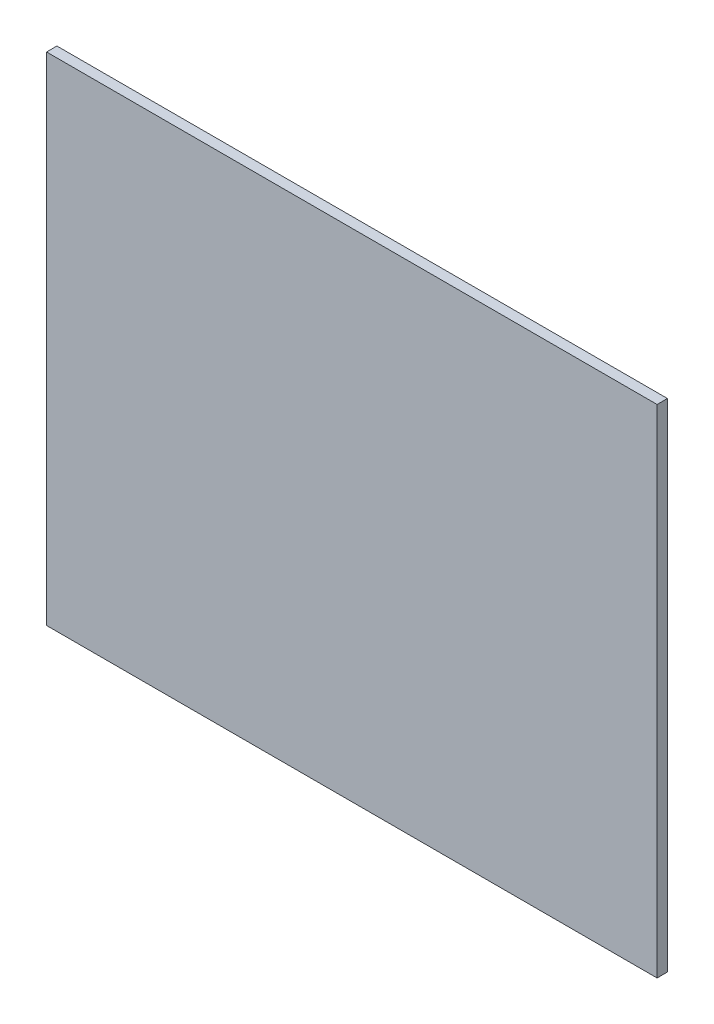
ISO-10303-21;
HEADER;
FILE_DESCRIPTION(('STEP AP214'),'2;1');
FILE_NAME('part.step','',(''),(''),'','','');
FILE_SCHEMA(('AUTOMOTIVE_DESIGN { 1 0 10303 214 1 1 1 1 }'));
ENDSEC;
DATA;
#1=APPLICATION_CONTEXT('core data for automotive mechanical design processes');
#2=APPLICATION_PROTOCOL_DEFINITION('international standard','automotive_design',2000,#1);
#3=PRODUCT_CONTEXT('',#1,'mechanical');
#4=PRODUCT('Part','Part','',(#3));
#5=PRODUCT_RELATED_PRODUCT_CATEGORY('part','',(#4));
#6=PRODUCT_DEFINITION_FORMATION('','',#4);
#7=PRODUCT_DEFINITION_CONTEXT('part definition',#1,'design');
#8=PRODUCT_DEFINITION('design','',#6,#7);
#9=PRODUCT_DEFINITION_SHAPE('','',#8);
#10=(LENGTH_UNIT() NAMED_UNIT(*) SI_UNIT(.MILLI.,.METRE.));
#11=(NAMED_UNIT(*) PLANE_ANGLE_UNIT() SI_UNIT($,.RADIAN.));
#12=(NAMED_UNIT(*) SI_UNIT($,.STERADIAN.) SOLID_ANGLE_UNIT());
#13=UNCERTAINTY_MEASURE_WITH_UNIT(LENGTH_MEASURE(1.E-05),#10,'distance_accuracy_value','');
#14=(GEOMETRIC_REPRESENTATION_CONTEXT(3) GLOBAL_UNCERTAINTY_ASSIGNED_CONTEXT((#13)) GLOBAL_UNIT_ASSIGNED_CONTEXT((#10,
#11,#12)) REPRESENTATION_CONTEXT('',''));
#15=CARTESIAN_POINT('',(0.,0.,0.));
#16=DIRECTION('',(0.,0.,1.));
#17=DIRECTION('',(1.,0.,0.));
#18=AXIS2_PLACEMENT_3D('',#15,#16,#17);
#19=CARTESIAN_POINT('',(147.5,-120.,5.));
#20=DIRECTION('',(-1.,0.,0.));
#21=DIRECTION('',(0.,0.,1.));
#22=AXIS2_PLACEMENT_3D('',#19,#20,#21);
#23=PLANE('',#22);
#24=DIRECTION('',(0.,1.,0.));
#25=VECTOR('',#24,1.);
#26=CARTESIAN_POINT('',(147.5,-120.,0.));
#27=LINE('',#26,#25);
#28=CARTESIAN_POINT('',(147.5,-120.,0.));
#29=VERTEX_POINT('',#28);
#30=CARTESIAN_POINT('',(147.5,120.,0.));
#31=VERTEX_POINT('',#30);
#32=EDGE_CURVE('E107',#29,#31,#27,.T.);
#33=ORIENTED_EDGE('',*,*,#32,.T.);
#34=DIRECTION('',(0.,0.,-1.));
#35=VECTOR('',#34,1.);
#36=CARTESIAN_POINT('',(147.5,120.,5.));
#37=LINE('',#36,#35);
#38=CARTESIAN_POINT('',(147.5,120.,5.));
#39=VERTEX_POINT('',#38);
#40=EDGE_CURVE('E11',#39,#31,#37,.T.);
#41=ORIENTED_EDGE('',*,*,#40,.F.);
#42=DIRECTION('',(0.,1.,0.));
#43=VECTOR('',#42,1.);
#44=CARTESIAN_POINT('',(147.5,-120.,5.));
#45=LINE('',#44,#43);
#46=CARTESIAN_POINT('',(147.5,-120.,5.));
#47=VERTEX_POINT('',#46);
#48=EDGE_CURVE('E91',#47,#39,#45,.T.);
#49=ORIENTED_EDGE('',*,*,#48,.F.);
#50=DIRECTION('',(0.,0.,-1.));
#51=VECTOR('',#50,1.);
#52=CARTESIAN_POINT('',(147.5,-120.,5.));
#53=LINE('',#52,#51);
#54=EDGE_CURVE('E103',#47,#29,#53,.T.);
#55=ORIENTED_EDGE('',*,*,#54,.T.);
#56=EDGE_LOOP('',(#33,#41,#49,#55));
#57=FACE_BOUND('',#56,.T.);
#58=ADVANCED_FACE('F39',(#57),#23,.F.);
#59=CARTESIAN_POINT('',(-147.5,120.,5.));
#60=DIRECTION('',(0.,-1.,0.));
#61=DIRECTION('',(0.,0.,-1.));
#62=AXIS2_PLACEMENT_3D('',#59,#60,#61);
#63=PLANE('',#62);
#64=DIRECTION('',(-1.,0.,0.));
#65=VECTOR('',#64,1.);
#66=CARTESIAN_POINT('',(-147.5,120.,0.));
#67=LINE('',#66,#65);
#68=CARTESIAN_POINT('',(-147.5,120.,0.));
#69=VERTEX_POINT('',#68);
#70=EDGE_CURVE('E96',#31,#69,#67,.T.);
#71=ORIENTED_EDGE('',*,*,#70,.T.);
#72=DIRECTION('',(0.,0.,-1.));
#73=VECTOR('',#72,1.);
#74=CARTESIAN_POINT('',(-147.5,120.,5.));
#75=LINE('',#74,#73);
#76=CARTESIAN_POINT('',(-147.5,120.,5.));
#77=VERTEX_POINT('',#76);
#78=EDGE_CURVE('E48',#77,#69,#75,.T.);
#79=ORIENTED_EDGE('',*,*,#78,.F.);
#80=DIRECTION('',(-1.,0.,0.));
#81=VECTOR('',#80,1.);
#82=CARTESIAN_POINT('',(-147.5,120.,5.));
#83=LINE('',#82,#81);
#84=EDGE_CURVE('E86',#39,#77,#83,.T.);
#85=ORIENTED_EDGE('',*,*,#84,.F.);
#86=ORIENTED_EDGE('',*,*,#40,.T.);
#87=EDGE_LOOP('',(#71,#79,#85,#86));
#88=FACE_BOUND('',#87,.T.);
#89=ADVANCED_FACE('F95',(#88),#63,.F.);
#90=CARTESIAN_POINT('',(-147.5,-120.,5.));
#91=DIRECTION('',(1.,0.,0.));
#92=DIRECTION('',(0.,0.,-1.));
#93=AXIS2_PLACEMENT_3D('',#90,#91,#92);
#94=PLANE('',#93);
#95=DIRECTION('',(0.,-1.,0.));
#96=VECTOR('',#95,1.);
#97=CARTESIAN_POINT('',(-147.5,-120.,0.));
#98=LINE('',#97,#96);
#99=CARTESIAN_POINT('',(-147.5,-120.,0.));
#100=VERTEX_POINT('',#99);
#101=EDGE_CURVE('E73',#69,#100,#98,.T.);
#102=ORIENTED_EDGE('',*,*,#101,.T.);
#103=DIRECTION('',(0.,0.,-1.));
#104=VECTOR('',#103,1.);
#105=CARTESIAN_POINT('',(-147.5,-120.,5.));
#106=LINE('',#105,#104);
#107=CARTESIAN_POINT('',(-147.5,-120.,5.));
#108=VERTEX_POINT('',#107);
#109=EDGE_CURVE('E98',#108,#100,#106,.T.);
#110=ORIENTED_EDGE('',*,*,#109,.F.);
#111=DIRECTION('',(0.,-1.,0.));
#112=VECTOR('',#111,1.);
#113=CARTESIAN_POINT('',(-147.5,-120.,5.));
#114=LINE('',#113,#112);
#115=EDGE_CURVE('E89',#77,#108,#114,.T.);
#116=ORIENTED_EDGE('',*,*,#115,.F.);
#117=ORIENTED_EDGE('',*,*,#78,.T.);
#118=EDGE_LOOP('',(#102,#110,#116,#117));
#119=FACE_BOUND('',#118,.T.);
#120=ADVANCED_FACE('F99',(#119),#94,.F.);
#121=CARTESIAN_POINT('',(-147.5,-120.,5.));
#122=DIRECTION('',(0.,1.,0.));
#123=DIRECTION('',(0.,0.,1.));
#124=AXIS2_PLACEMENT_3D('',#121,#122,#123);
#125=PLANE('',#124);
#126=DIRECTION('',(1.,0.,0.));
#127=VECTOR('',#126,1.);
#128=CARTESIAN_POINT('',(-147.5,-120.,0.));
#129=LINE('',#128,#127);
#130=EDGE_CURVE('E79',#100,#29,#129,.T.);
#131=ORIENTED_EDGE('',*,*,#130,.T.);
#132=ORIENTED_EDGE('',*,*,#54,.F.);
#133=DIRECTION('',(1.,0.,0.));
#134=VECTOR('',#133,1.);
#135=CARTESIAN_POINT('',(-147.5,-120.,5.));
#136=LINE('',#135,#134);
#137=EDGE_CURVE('E56',#108,#47,#136,.T.);
#138=ORIENTED_EDGE('',*,*,#137,.F.);
#139=ORIENTED_EDGE('',*,*,#109,.T.);
#140=EDGE_LOOP('',(#131,#132,#138,#139));
#141=FACE_BOUND('',#140,.T.);
#142=ADVANCED_FACE('F120',(#141),#125,.F.);
#143=CARTESIAN_POINT('',(0.,0.,5.));
#144=DIRECTION('',(0.,0.,-1.));
#145=DIRECTION('',(-1.,0.,0.));
#146=AXIS2_PLACEMENT_3D('',#143,#144,#145);
#147=PLANE('',#146);
#148=ORIENTED_EDGE('',*,*,#48,.T.);
#149=ORIENTED_EDGE('',*,*,#84,.T.);
#150=ORIENTED_EDGE('',*,*,#115,.T.);
#151=ORIENTED_EDGE('',*,*,#137,.T.);
#152=EDGE_LOOP('',(#148,#149,#150,#151));
#153=FACE_BOUND('',#152,.T.);
#154=ADVANCED_FACE('F87',(#153),#147,.F.);
#155=CARTESIAN_POINT('',(0.,0.,0.));
#156=DIRECTION('',(0.,0.,-1.));
#157=DIRECTION('',(-1.,0.,0.));
#158=AXIS2_PLACEMENT_3D('',#155,#156,#157);
#159=PLANE('',#158);
#160=ORIENTED_EDGE('',*,*,#32,.F.);
#161=ORIENTED_EDGE('',*,*,#130,.F.);
#162=ORIENTED_EDGE('',*,*,#101,.F.);
#163=ORIENTED_EDGE('',*,*,#70,.F.);
#164=EDGE_LOOP('',(#160,#161,#162,#163));
#165=FACE_BOUND('',#164,.T.);
#166=ADVANCED_FACE('F123',(#165),#159,.T.);
#167=CLOSED_SHELL('',(#58,#89,#120,#142,#154,#166));
#168=MANIFOLD_SOLID_BREP('B2',#167);
#169=ADVANCED_BREP_SHAPE_REPRESENTATION('',(#18,#168),#14);
#170=SHAPE_DEFINITION_REPRESENTATION(#9,#169);
ENDSEC;
END-ISO-10303-21;
